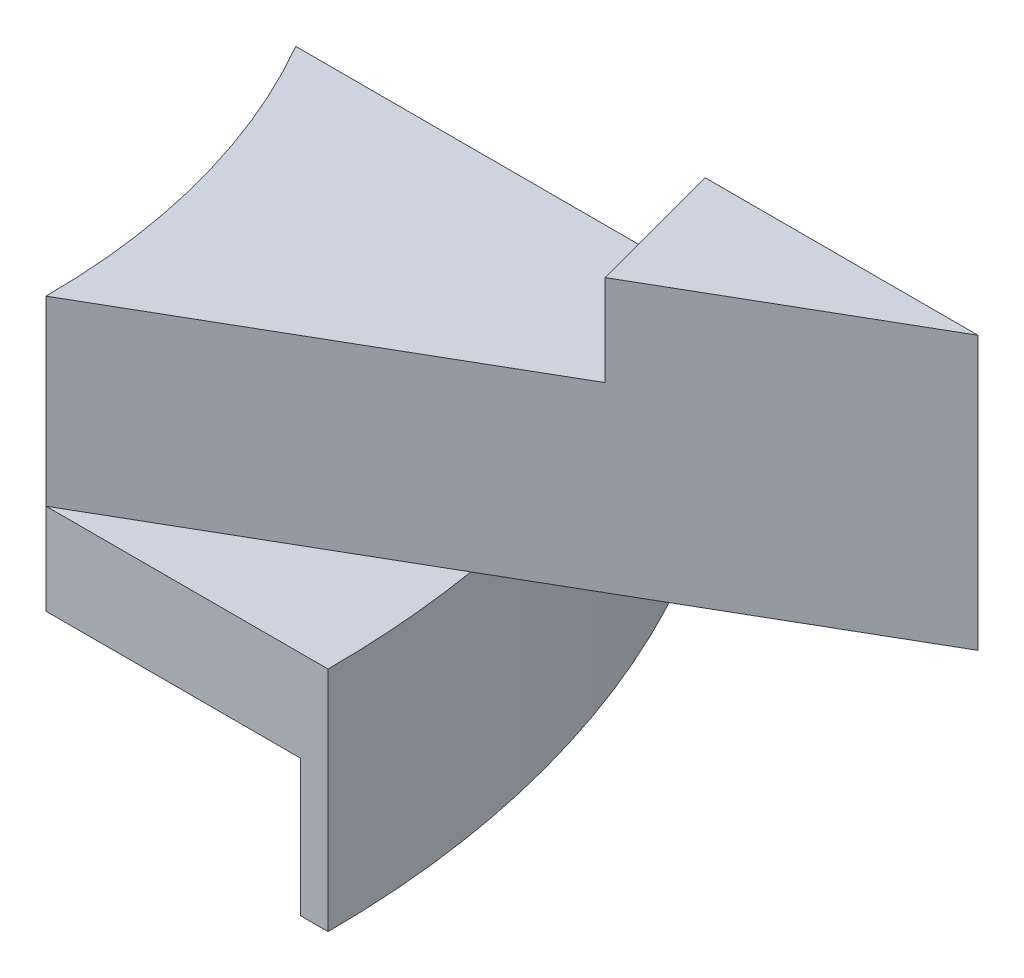
ISO-10303-21;
HEADER;
FILE_DESCRIPTION(('STEP AP214'),'2;1');
FILE_NAME('part.step','',(''),(''),'','','');
FILE_SCHEMA(('AUTOMOTIVE_DESIGN { 1 0 10303 214 1 1 1 1 }'));
ENDSEC;
DATA;
#1=APPLICATION_CONTEXT('core data for automotive mechanical design processes');
#2=APPLICATION_PROTOCOL_DEFINITION('international standard','automotive_design',2000,#1);
#3=PRODUCT_CONTEXT('',#1,'mechanical');
#4=PRODUCT('Part','Part','',(#3));
#5=PRODUCT_RELATED_PRODUCT_CATEGORY('part','',(#4));
#6=PRODUCT_DEFINITION_FORMATION('','',#4);
#7=PRODUCT_DEFINITION_CONTEXT('part definition',#1,'design');
#8=PRODUCT_DEFINITION('design','',#6,#7);
#9=PRODUCT_DEFINITION_SHAPE('','',#8);
#10=(LENGTH_UNIT() NAMED_UNIT(*) SI_UNIT(.MILLI.,.METRE.));
#11=(NAMED_UNIT(*) PLANE_ANGLE_UNIT() SI_UNIT($,.RADIAN.));
#12=(NAMED_UNIT(*) SI_UNIT($,.STERADIAN.) SOLID_ANGLE_UNIT());
#13=UNCERTAINTY_MEASURE_WITH_UNIT(LENGTH_MEASURE(1.E-05),#10,'distance_accuracy_value','');
#14=(GEOMETRIC_REPRESENTATION_CONTEXT(3) GLOBAL_UNCERTAINTY_ASSIGNED_CONTEXT((#13)) GLOBAL_UNIT_ASSIGNED_CONTEXT((#10,
#11,#12)) REPRESENTATION_CONTEXT('',''));
#15=CARTESIAN_POINT('',(0.,0.,0.));
#16=DIRECTION('',(0.,0.,1.));
#17=DIRECTION('',(1.,0.,0.));
#18=AXIS2_PLACEMENT_3D('',#15,#16,#17);
#19=CARTESIAN_POINT('',(0.,10.,0.));
#20=DIRECTION('',(0.,1.,0.));
#21=DIRECTION('',(0.,0.,1.));
#22=AXIS2_PLACEMENT_3D('',#19,#20,#21);
#23=PLANE('',#22);
#24=DIRECTION('',(-0.866025403784438,0.,0.500000000000001));
#25=VECTOR('',#24,1.);
#26=CARTESIAN_POINT('',(64.9519052838328,10.,-37.5000000000001));
#27=LINE('',#26,#25);
#28=CARTESIAN_POINT('',(91.7986928011504,10.,-53.0000000000001));
#29=VERTEX_POINT('',#28);
#30=CARTESIAN_POINT('',(64.9519052838328,10.,-37.5000000000001));
#31=VERTEX_POINT('',#30);
#32=EDGE_CURVE('E211',#29,#31,#27,.T.);
#33=ORIENTED_EDGE('',*,*,#32,.T.);
#34=DIRECTION('',(1.,0.,0.));
#35=VECTOR('',#34,1.);
#36=CARTESIAN_POINT('',(64.9519052838328,10.,-37.5000000000001));
#37=LINE('',#36,#35);
#38=CARTESIAN_POINT('',(99.1450956931304,10.,-37.5000000000002));
#39=VERTEX_POINT('',#38);
#40=EDGE_CURVE('E198',#31,#39,#37,.T.);
#41=ORIENTED_EDGE('',*,*,#40,.T.);
#42=CARTESIAN_POINT('',(0.,10.,0.));
#43=DIRECTION('',(0.,-1.,0.));
#44=DIRECTION('',(0.,0.,-1.));
#45=AXIS2_PLACEMENT_3D('',#42,#43,#44);
#46=CIRCLE('',#45,106.);
#47=EDGE_CURVE('E151',#29,#39,#46,.T.);
#48=ORIENTED_EDGE('',*,*,#47,.F.);
#49=EDGE_LOOP('',(#33,#41,#48));
#50=FACE_BOUND('',#49,.T.);
#51=ADVANCED_FACE('F45',(#50),#23,.T.);
#52=DIRECTION('',(1.,0.,0.));
#53=VECTOR('',#52,1.);
#54=CARTESIAN_POINT('',(75.,10.,0.));
#55=LINE('',#54,#53);
#56=CARTESIAN_POINT('',(75.,10.,0.));
#57=VERTEX_POINT('',#56);
#58=CARTESIAN_POINT('',(106.,10.,0.));
#59=VERTEX_POINT('',#58);
#60=EDGE_CURVE('E215',#57,#59,#55,.T.);
#61=ORIENTED_EDGE('',*,*,#60,.T.);
#62=CARTESIAN_POINT('',(104.61217153089,10.,-17.0965952046487));
#63=VERTEX_POINT('',#62);
#64=EDGE_CURVE('E255',#63,#59,#46,.T.);
#65=ORIENTED_EDGE('',*,*,#64,.F.);
#66=DIRECTION('',(-0.86602540378444,0.,0.499999999999998));
#67=VECTOR('',#66,1.);
#68=CARTESIAN_POINT('',(139.951905283834,10.,-37.5000000000004));
#69=LINE('',#68,#67);
#70=EDGE_CURVE('E11',#63,#57,#69,.T.);
#71=ORIENTED_EDGE('',*,*,#70,.T.);
#72=EDGE_LOOP('',(#61,#65,#71));
#73=FACE_BOUND('',#72,.T.);
#74=ADVANCED_FACE('F265',(#73),#23,.T.);
#75=CARTESIAN_POINT('',(64.9519052838328,10.,-37.5000000000001));
#76=DIRECTION('',(0.500000000000001,0.,0.866025403784438));
#77=DIRECTION('',(0.866025403784438,0.,-0.500000000000001));
#78=AXIS2_PLACEMENT_3D('',#75,#76,#77);
#79=PLANE('',#78);
#80=DIRECTION('',(-0.866025403784438,0.,0.500000000000001));
#81=VECTOR('',#80,1.);
#82=CARTESIAN_POINT('',(64.9519052838328,0.,-37.5000000000001));
#83=LINE('',#82,#81);
#84=CARTESIAN_POINT('',(89.2006165897971,0.,-51.5000000000001));
#85=VERTEX_POINT('',#84);
#86=CARTESIAN_POINT('',(64.9519052838328,0.,-37.5000000000001));
#87=VERTEX_POINT('',#86);
#88=EDGE_CURVE('E222',#85,#87,#83,.T.);
#89=ORIENTED_EDGE('',*,*,#88,.T.);
#90=DIRECTION('',(0.,-1.,0.));
#91=VECTOR('',#90,1.);
#92=CARTESIAN_POINT('',(64.9519052838328,10.,-37.5000000000001));
#93=LINE('',#92,#91);
#94=EDGE_CURVE('E49',#31,#87,#93,.T.);
#95=ORIENTED_EDGE('',*,*,#94,.F.);
#96=ORIENTED_EDGE('',*,*,#32,.F.);
#97=DIRECTION('',(0.,1.,0.));
#98=VECTOR('',#97,1.);
#99=CARTESIAN_POINT('',(91.7986928011504,-15.,-53.0000000000001));
#100=LINE('',#99,#98);
#101=CARTESIAN_POINT('',(91.7986928011504,-15.,-53.0000000000001));
#102=VERTEX_POINT('',#101);
#103=EDGE_CURVE('E136',#102,#29,#100,.T.);
#104=ORIENTED_EDGE('',*,*,#103,.F.);
#105=DIRECTION('',(0.866025403784438,0.,-0.500000000000002));
#106=VECTOR('',#105,1.);
#107=CARTESIAN_POINT('',(89.2006165897971,-15.,-51.5000000000001));
#108=LINE('',#107,#106);
#109=CARTESIAN_POINT('',(89.2006165897971,-15.,-51.5000000000001));
#110=VERTEX_POINT('',#109);
#111=EDGE_CURVE('E131',#110,#102,#108,.T.);
#112=ORIENTED_EDGE('',*,*,#111,.F.);
#113=DIRECTION('',(0.,1.,0.));
#114=VECTOR('',#113,1.);
#115=CARTESIAN_POINT('',(89.2006165897971,-15.,-51.5000000000001));
#116=LINE('',#115,#114);
#117=EDGE_CURVE('E134',#110,#85,#116,.T.);
#118=ORIENTED_EDGE('',*,*,#117,.T.);
#119=EDGE_LOOP('',(#89,#95,#96,#104,#112,#118));
#120=FACE_BOUND('',#119,.T.);
#121=ADVANCED_FACE('F47',(#120),#79,.F.);
#122=CARTESIAN_POINT('',(0.,10.,0.));
#123=DIRECTION('',(0.,-1.,0.));
#124=DIRECTION('',(0.,0.,-1.));
#125=AXIS2_PLACEMENT_3D('',#122,#123,#124);
#126=CYLINDRICAL_SURFACE('',#125,75.);
#127=CARTESIAN_POINT('',(0.,0.,0.));
#128=DIRECTION('',(0.,-1.,0.));
#129=DIRECTION('',(0.,0.,-1.));
#130=AXIS2_PLACEMENT_3D('',#127,#128,#129);
#131=CIRCLE('',#130,75.);
#132=CARTESIAN_POINT('',(75.,0.,0.));
#133=VERTEX_POINT('',#132);
#134=EDGE_CURVE('E225',#87,#133,#131,.T.);
#135=ORIENTED_EDGE('',*,*,#134,.T.);
#136=DIRECTION('',(0.,-1.,0.));
#137=VECTOR('',#136,1.);
#138=CARTESIAN_POINT('',(75.,10.,0.));
#139=LINE('',#138,#137);
#140=EDGE_CURVE('E219',#57,#133,#139,.T.);
#141=ORIENTED_EDGE('',*,*,#140,.F.);
#142=DIRECTION('',(0.,-1.,0.));
#143=VECTOR('',#142,1.);
#144=CARTESIAN_POINT('',(75.,30.,0.));
#145=LINE('',#144,#143);
#146=CARTESIAN_POINT('',(75.,30.,0.));
#147=VERTEX_POINT('',#146);
#148=EDGE_CURVE('E201',#147,#57,#145,.T.);
#149=ORIENTED_EDGE('',*,*,#148,.F.);
#150=CARTESIAN_POINT('',(0.,30.,0.));
#151=DIRECTION('',(0.,1.,0.));
#152=DIRECTION('',(0.,0.,1.));
#153=AXIS2_PLACEMENT_3D('',#150,#151,#152);
#154=CIRCLE('',#153,75.);
#155=CARTESIAN_POINT('',(64.9519052838328,30.,-37.5000000000001));
#156=VERTEX_POINT('',#155);
#157=EDGE_CURVE('E186',#147,#156,#154,.T.);
#158=ORIENTED_EDGE('',*,*,#157,.T.);
#159=DIRECTION('',(0.,-1.,0.));
#160=VECTOR('',#159,1.);
#161=CARTESIAN_POINT('',(64.9519052838328,30.,-37.5000000000001));
#162=LINE('',#161,#160);
#163=EDGE_CURVE('E196',#156,#31,#162,.T.);
#164=ORIENTED_EDGE('',*,*,#163,.T.);
#165=ORIENTED_EDGE('',*,*,#94,.T.);
#166=EDGE_LOOP('',(#135,#141,#149,#158,#164,#165));
#167=FACE_BOUND('',#166,.T.);
#168=ADVANCED_FACE('F240',(#167),#126,.F.);
#169=CARTESIAN_POINT('',(75.,10.,0.));
#170=DIRECTION('',(0.,0.,-1.));
#171=DIRECTION('',(-1.,0.,0.));
#172=AXIS2_PLACEMENT_3D('',#169,#170,#171);
#173=PLANE('',#172);
#174=DIRECTION('',(1.,0.,0.));
#175=VECTOR('',#174,1.);
#176=CARTESIAN_POINT('',(75.,0.,0.));
#177=LINE('',#176,#175);
#178=CARTESIAN_POINT('',(103.,0.,0.));
#179=VERTEX_POINT('',#178);
#180=EDGE_CURVE('E216',#133,#179,#177,.T.);
#181=ORIENTED_EDGE('',*,*,#180,.T.);
#182=DIRECTION('',(0.,1.,0.));
#183=VECTOR('',#182,1.);
#184=CARTESIAN_POINT('',(103.,-15.,0.));
#185=LINE('',#184,#183);
#186=CARTESIAN_POINT('',(103.,-15.,0.));
#187=VERTEX_POINT('',#186);
#188=EDGE_CURVE('E244',#187,#179,#185,.T.);
#189=ORIENTED_EDGE('',*,*,#188,.F.);
#190=DIRECTION('',(-1.,0.,0.));
#191=VECTOR('',#190,1.);
#192=CARTESIAN_POINT('',(103.,-15.,0.));
#193=LINE('',#192,#191);
#194=CARTESIAN_POINT('',(106.,-15.,0.));
#195=VERTEX_POINT('',#194);
#196=EDGE_CURVE('E146',#195,#187,#193,.T.);
#197=ORIENTED_EDGE('',*,*,#196,.F.);
#198=DIRECTION('',(0.,1.,0.));
#199=VECTOR('',#198,1.);
#200=CARTESIAN_POINT('',(106.,-15.,0.));
#201=LINE('',#200,#199);
#202=EDGE_CURVE('E163',#195,#59,#201,.T.);
#203=ORIENTED_EDGE('',*,*,#202,.T.);
#204=ORIENTED_EDGE('',*,*,#60,.F.);
#205=ORIENTED_EDGE('',*,*,#140,.T.);
#206=EDGE_LOOP('',(#181,#189,#197,#203,#204,#205));
#207=FACE_BOUND('',#206,.T.);
#208=ADVANCED_FACE('F243',(#207),#173,.F.);
#209=CARTESIAN_POINT('',(0.,0.,0.));
#210=DIRECTION('',(0.,1.,0.));
#211=DIRECTION('',(0.,0.,1.));
#212=AXIS2_PLACEMENT_3D('',#209,#210,#211);
#213=PLANE('',#212);
#214=CARTESIAN_POINT('',(0.,0.,0.));
#215=DIRECTION('',(0.,1.,0.));
#216=DIRECTION('',(0.,0.,1.));
#217=AXIS2_PLACEMENT_3D('',#214,#215,#216);
#218=CIRCLE('',#217,103.);
#219=EDGE_CURVE('E156',#179,#85,#218,.T.);
#220=ORIENTED_EDGE('',*,*,#219,.F.);
#221=ORIENTED_EDGE('',*,*,#180,.F.);
#222=ORIENTED_EDGE('',*,*,#134,.F.);
#223=ORIENTED_EDGE('',*,*,#88,.F.);
#224=EDGE_LOOP('',(#220,#221,#222,#223));
#225=FACE_BOUND('',#224,.T.);
#226=ADVANCED_FACE('F242',(#225),#213,.F.);
#227=CARTESIAN_POINT('',(0.,10.,0.));
#228=DIRECTION('',(0.,1.,0.));
#229=DIRECTION('',(0.,0.,1.));
#230=AXIS2_PLACEMENT_3D('',#227,#228,#229);
#231=PLANE('',#230);
#232=EDGE_CURVE('E254',#39,#63,#46,.T.);
#233=ORIENTED_EDGE('',*,*,#232,.F.);
#234=CARTESIAN_POINT('',(139.951905283834,10.,-37.5000000000004));
#235=VERTEX_POINT('',#234);
#236=EDGE_CURVE('E185',#39,#235,#37,.T.);
#237=ORIENTED_EDGE('',*,*,#236,.T.);
#238=EDGE_CURVE('E56',#235,#63,#69,.T.);
#239=ORIENTED_EDGE('',*,*,#238,.T.);
#240=EDGE_LOOP('',(#233,#237,#239));
#241=FACE_BOUND('',#240,.T.);
#242=ADVANCED_FACE('F282',(#241),#231,.F.);
#243=CARTESIAN_POINT('',(139.951905283834,30.,-37.5000000000004));
#244=DIRECTION('',(0.499999999999998,0.,0.86602540378444));
#245=DIRECTION('',(0.86602540378444,0.,-0.499999999999998));
#246=AXIS2_PLACEMENT_3D('',#243,#244,#245);
#247=PLANE('',#246);
#248=ORIENTED_EDGE('',*,*,#238,.F.);
#249=DIRECTION('',(0.,-1.,0.));
#250=VECTOR('',#249,1.);
#251=CARTESIAN_POINT('',(139.951905283834,30.,-37.5000000000004));
#252=LINE('',#251,#250);
#253=CARTESIAN_POINT('',(139.951905283834,40.,-37.5000000000004));
#254=VERTEX_POINT('',#253);
#255=EDGE_CURVE('E204',#254,#235,#252,.T.);
#256=ORIENTED_EDGE('',*,*,#255,.F.);
#257=DIRECTION('',(0.866025403784439,0.,-0.5));
#258=VECTOR('',#257,1.);
#259=CARTESIAN_POINT('',(139.951905283834,40.,-37.5000000000004));
#260=LINE('',#259,#258);
#261=CARTESIAN_POINT('',(113.971143170301,40.,-22.5000000000004));
#262=VERTEX_POINT('',#261);
#263=EDGE_CURVE('E170',#262,#254,#260,.T.);
#264=ORIENTED_EDGE('',*,*,#263,.F.);
#265=DIRECTION('',(0.,-1.,0.));
#266=VECTOR('',#265,1.);
#267=CARTESIAN_POINT('',(113.971143170301,40.,-22.5000000000004));
#268=LINE('',#267,#266);
#269=CARTESIAN_POINT('',(113.971143170301,30.,-22.5000000000004));
#270=VERTEX_POINT('',#269);
#271=EDGE_CURVE('E181',#262,#270,#268,.T.);
#272=ORIENTED_EDGE('',*,*,#271,.T.);
#273=DIRECTION('',(-0.86602540378444,0.,0.499999999999998));
#274=VECTOR('',#273,1.);
#275=CARTESIAN_POINT('',(139.951905283834,30.,-37.5000000000004));
#276=LINE('',#275,#274);
#277=EDGE_CURVE('E193',#270,#147,#276,.T.);
#278=ORIENTED_EDGE('',*,*,#277,.T.);
#279=ORIENTED_EDGE('',*,*,#148,.T.);
#280=ORIENTED_EDGE('',*,*,#70,.F.);
#281=EDGE_LOOP('',(#248,#256,#264,#272,#278,#279,#280));
#282=FACE_BOUND('',#281,.T.);
#283=ADVANCED_FACE('F280',(#282),#247,.T.);
#284=CARTESIAN_POINT('',(64.9519052838328,30.,-37.5000000000001));
#285=DIRECTION('',(0.,0.,-1.));
#286=DIRECTION('',(-1.,0.,0.));
#287=AXIS2_PLACEMENT_3D('',#284,#285,#286);
#288=PLANE('',#287);
#289=ORIENTED_EDGE('',*,*,#40,.F.);
#290=ORIENTED_EDGE('',*,*,#163,.F.);
#291=DIRECTION('',(1.,0.,0.));
#292=VECTOR('',#291,1.);
#293=CARTESIAN_POINT('',(64.9519052838328,30.,-37.5000000000001));
#294=LINE('',#293,#292);
#295=CARTESIAN_POINT('',(109.951905283834,30.,-37.5000000000003));
#296=VERTEX_POINT('',#295);
#297=EDGE_CURVE('E190',#156,#296,#294,.T.);
#298=ORIENTED_EDGE('',*,*,#297,.T.);
#299=DIRECTION('',(0.,-1.,0.));
#300=VECTOR('',#299,1.);
#301=CARTESIAN_POINT('',(109.951905283834,40.,-37.5000000000001));
#302=LINE('',#301,#300);
#303=CARTESIAN_POINT('',(109.951905283834,40.,-37.5000000000001));
#304=VERTEX_POINT('',#303);
#305=EDGE_CURVE('E176',#304,#296,#302,.T.);
#306=ORIENTED_EDGE('',*,*,#305,.F.);
#307=DIRECTION('',(-1.,0.,0.));
#308=VECTOR('',#307,1.);
#309=CARTESIAN_POINT('',(109.951905283834,40.,-37.5000000000001));
#310=LINE('',#309,#308);
#311=EDGE_CURVE('E174',#254,#304,#310,.T.);
#312=ORIENTED_EDGE('',*,*,#311,.F.);
#313=ORIENTED_EDGE('',*,*,#255,.T.);
#314=ORIENTED_EDGE('',*,*,#236,.F.);
#315=EDGE_LOOP('',(#289,#290,#298,#306,#312,#313,#314));
#316=FACE_BOUND('',#315,.T.);
#317=ADVANCED_FACE('F271',(#316),#288,.T.);
#318=CARTESIAN_POINT('',(0.,30.,0.));
#319=DIRECTION('',(0.,1.,0.));
#320=DIRECTION('',(0.,0.,1.));
#321=AXIS2_PLACEMENT_3D('',#318,#319,#320);
#322=PLANE('',#321);
#323=DIRECTION('',(0.258819045102525,0.,0.965925826289067));
#324=VECTOR('',#323,1.);
#325=CARTESIAN_POINT('',(113.971143170301,30.,-22.5000000000004));
#326=LINE('',#325,#324);
#327=EDGE_CURVE('E69',#296,#270,#326,.T.);
#328=ORIENTED_EDGE('',*,*,#327,.F.);
#329=ORIENTED_EDGE('',*,*,#297,.F.);
#330=ORIENTED_EDGE('',*,*,#157,.F.);
#331=ORIENTED_EDGE('',*,*,#277,.F.);
#332=EDGE_LOOP('',(#328,#329,#330,#331));
#333=FACE_BOUND('',#332,.T.);
#334=ADVANCED_FACE('F268',(#333),#322,.T.);
#335=CARTESIAN_POINT('',(113.971143170301,40.,-22.5000000000004));
#336=DIRECTION('',(0.965925826289067,0.,-0.258819045102525));
#337=DIRECTION('',(-0.258819045102525,0.,-0.965925826289067));
#338=AXIS2_PLACEMENT_3D('',#335,#336,#337);
#339=PLANE('',#338);
#340=ORIENTED_EDGE('',*,*,#327,.T.);
#341=ORIENTED_EDGE('',*,*,#271,.F.);
#342=DIRECTION('',(0.258819045102525,0.,0.965925826289067));
#343=VECTOR('',#342,1.);
#344=CARTESIAN_POINT('',(113.971143170301,40.,-22.5000000000004));
#345=LINE('',#344,#343);
#346=EDGE_CURVE('E161',#304,#262,#345,.T.);
#347=ORIENTED_EDGE('',*,*,#346,.F.);
#348=ORIENTED_EDGE('',*,*,#305,.T.);
#349=EDGE_LOOP('',(#340,#341,#347,#348));
#350=FACE_BOUND('',#349,.T.);
#351=ADVANCED_FACE('F275',(#350),#339,.F.);
#352=CARTESIAN_POINT('',(0.,40.,0.));
#353=DIRECTION('',(0.,-1.,0.));
#354=DIRECTION('',(0.,0.,-1.));
#355=AXIS2_PLACEMENT_3D('',#352,#353,#354);
#356=PLANE('',#355);
#357=ORIENTED_EDGE('',*,*,#346,.T.);
#358=ORIENTED_EDGE('',*,*,#263,.T.);
#359=ORIENTED_EDGE('',*,*,#311,.T.);
#360=EDGE_LOOP('',(#357,#358,#359));
#361=FACE_BOUND('',#360,.T.);
#362=ADVANCED_FACE('F278',(#361),#356,.F.);
#363=CARTESIAN_POINT('',(0.,-15.,0.));
#364=DIRECTION('',(0.,1.,0.));
#365=DIRECTION('',(0.,0.,1.));
#366=AXIS2_PLACEMENT_3D('',#363,#364,#365);
#367=CYLINDRICAL_SURFACE('',#366,103.);
#368=ORIENTED_EDGE('',*,*,#188,.T.);
#369=ORIENTED_EDGE('',*,*,#219,.T.);
#370=ORIENTED_EDGE('',*,*,#117,.F.);
#371=CARTESIAN_POINT('',(0.,-15.,0.));
#372=DIRECTION('',(0.,1.,0.));
#373=DIRECTION('',(0.,0.,-1.));
#374=AXIS2_PLACEMENT_3D('',#371,#372,#373);
#375=CIRCLE('',#374,103.);
#376=EDGE_CURVE('E141',#187,#110,#375,.T.);
#377=ORIENTED_EDGE('',*,*,#376,.F.);
#378=EDGE_LOOP('',(#368,#369,#370,#377));
#379=FACE_BOUND('',#378,.T.);
#380=ADVANCED_FACE('F154',(#379),#367,.F.);
#381=CARTESIAN_POINT('',(0.,-15.,0.));
#382=DIRECTION('',(0.,1.,0.));
#383=DIRECTION('',(0.,0.,1.));
#384=AXIS2_PLACEMENT_3D('',#381,#382,#383);
#385=CYLINDRICAL_SURFACE('',#384,106.);
#386=ORIENTED_EDGE('',*,*,#47,.T.);
#387=ORIENTED_EDGE('',*,*,#232,.T.);
#388=ORIENTED_EDGE('',*,*,#64,.T.);
#389=ORIENTED_EDGE('',*,*,#202,.F.);
#390=CARTESIAN_POINT('',(0.,-15.,0.));
#391=DIRECTION('',(0.,-1.,0.));
#392=DIRECTION('',(0.,0.,-1.));
#393=AXIS2_PLACEMENT_3D('',#390,#391,#392);
#394=CIRCLE('',#393,106.);
#395=EDGE_CURVE('E140',#102,#195,#394,.T.);
#396=ORIENTED_EDGE('',*,*,#395,.F.);
#397=ORIENTED_EDGE('',*,*,#103,.T.);
#398=EDGE_LOOP('',(#386,#387,#388,#389,#396,#397));
#399=FACE_BOUND('',#398,.T.);
#400=ADVANCED_FACE('F261',(#399),#385,.T.);
#401=CARTESIAN_POINT('',(0.,-15.,0.));
#402=DIRECTION('',(0.,-1.,0.));
#403=DIRECTION('',(0.,0.,-1.));
#404=AXIS2_PLACEMENT_3D('',#401,#402,#403);
#405=PLANE('',#404);
#406=ORIENTED_EDGE('',*,*,#376,.T.);
#407=ORIENTED_EDGE('',*,*,#111,.T.);
#408=ORIENTED_EDGE('',*,*,#395,.T.);
#409=ORIENTED_EDGE('',*,*,#196,.T.);
#410=EDGE_LOOP('',(#406,#407,#408,#409));
#411=FACE_BOUND('',#410,.T.);
#412=ADVANCED_FACE('F144',(#411),#405,.T.);
#413=CLOSED_SHELL('',(#51,#74,#121,#168,#208,#226,#242,#283,#317,#334,#351,#362,#380,#400,#412));
#414=MANIFOLD_SOLID_BREP('B2',#413);
#415=ADVANCED_BREP_SHAPE_REPRESENTATION('',(#18,#414),#14);
#416=SHAPE_DEFINITION_REPRESENTATION(#9,#415);
ENDSEC;
END-ISO-10303-21;
